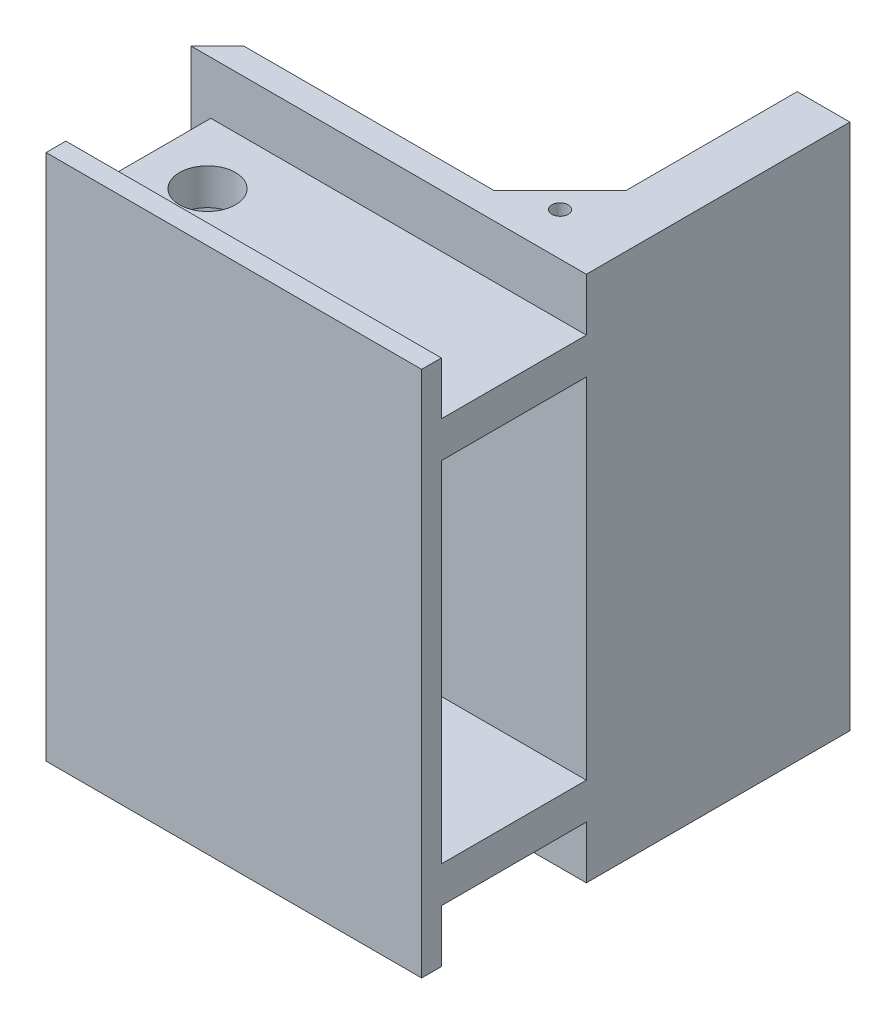
ISO-10303-21;
HEADER;
FILE_DESCRIPTION(('STEP AP214'),'2;1');
FILE_NAME('part.step','',(''),(''),'','','');
FILE_SCHEMA(('AUTOMOTIVE_DESIGN { 1 0 10303 214 1 1 1 1 }'));
ENDSEC;
DATA;
#1=APPLICATION_CONTEXT('core data for automotive mechanical design processes');
#2=APPLICATION_PROTOCOL_DEFINITION('international standard','automotive_design',2000,#1);
#3=PRODUCT_CONTEXT('',#1,'mechanical');
#4=PRODUCT('Part','Part','',(#3));
#5=PRODUCT_RELATED_PRODUCT_CATEGORY('part','',(#4));
#6=PRODUCT_DEFINITION_FORMATION('','',#4);
#7=PRODUCT_DEFINITION_CONTEXT('part definition',#1,'design');
#8=PRODUCT_DEFINITION('design','',#6,#7);
#9=PRODUCT_DEFINITION_SHAPE('','',#8);
#10=(LENGTH_UNIT() NAMED_UNIT(*) SI_UNIT(.MILLI.,.METRE.));
#11=(NAMED_UNIT(*) PLANE_ANGLE_UNIT() SI_UNIT($,.RADIAN.));
#12=(NAMED_UNIT(*) SI_UNIT($,.STERADIAN.) SOLID_ANGLE_UNIT());
#13=UNCERTAINTY_MEASURE_WITH_UNIT(LENGTH_MEASURE(1.E-05),#10,'distance_accuracy_value','');
#14=(GEOMETRIC_REPRESENTATION_CONTEXT(3) GLOBAL_UNCERTAINTY_ASSIGNED_CONTEXT((#13)) GLOBAL_UNIT_ASSIGNED_CONTEXT((#10,
#11,#12)) REPRESENTATION_CONTEXT('',''));
#15=CARTESIAN_POINT('',(0.,0.,0.));
#16=DIRECTION('',(0.,0.,1.));
#17=DIRECTION('',(1.,0.,0.));
#18=AXIS2_PLACEMENT_3D('',#15,#16,#17);
#19=CARTESIAN_POINT('',(-15.3516499079451,0.,15.687272498387));
#20=DIRECTION('',(0.707106781186544,0.,0.707106781186551));
#21=DIRECTION('',(0.,-1.,0.));
#22=AXIS2_PLACEMENT_3D('',#19,#20,#21);
#23=PLANE('',#22);
#24=DIRECTION('',(0.707106781186551,0.,-0.707106781186544));
#25=VECTOR('',#24,1.);
#26=CARTESIAN_POINT('',(-15.3516499079451,-4.00000000000001,15.687272498387));
#27=LINE('',#26,#25);
#28=CARTESIAN_POINT('',(-15.3516499079451,-4.00000000000001,15.687272498387));
#29=VERTEX_POINT('',#28);
#30=CARTESIAN_POINT('',(-5.35164990794507,-4.00000000000001,5.68727249838705));
#31=VERTEX_POINT('',#30);
#32=EDGE_CURVE('E11',#29,#31,#27,.T.);
#33=ORIENTED_EDGE('',*,*,#32,.F.);
#34=DIRECTION('',(0.,-1.,0.));
#35=VECTOR('',#34,1.);
#36=CARTESIAN_POINT('',(-15.3516499079451,0.,15.687272498387));
#37=LINE('',#36,#35);
#38=CARTESIAN_POINT('',(-15.3516499079451,0.,15.687272498387));
#39=VERTEX_POINT('',#38);
#40=EDGE_CURVE('E361',#39,#29,#37,.T.);
#41=ORIENTED_EDGE('',*,*,#40,.F.);
#42=DIRECTION('',(-0.707106781186551,0.,0.707106781186544));
#43=VECTOR('',#42,1.);
#44=CARTESIAN_POINT('',(-15.3516499079451,0.,15.687272498387));
#45=LINE('',#44,#43);
#46=CARTESIAN_POINT('',(-5.35164990794507,0.,5.68727249838709));
#47=VERTEX_POINT('',#46);
#48=EDGE_CURVE('E370',#47,#39,#45,.T.);
#49=ORIENTED_EDGE('',*,*,#48,.F.);
#50=DIRECTION('',(0.,1.,0.));
#51=VECTOR('',#50,1.);
#52=CARTESIAN_POINT('',(-5.35164990794507,0.,5.68727249838709));
#53=LINE('',#52,#51);
#54=EDGE_CURVE('E364',#31,#47,#53,.T.);
#55=ORIENTED_EDGE('',*,*,#54,.F.);
#56=EDGE_LOOP('',(#33,#41,#49,#55));
#57=FACE_BOUND('',#56,.T.);
#58=ADVANCED_FACE('F42',(#57),#23,.F.);
#59=DIRECTION('',(-0.707106781186551,0.,0.707106781186544));
#60=VECTOR('',#59,1.);
#61=CARTESIAN_POINT('',(-15.3516499079451,-76.,15.687272498387));
#62=LINE('',#61,#60);
#63=CARTESIAN_POINT('',(-5.35164990794507,-76.,5.68727249838705));
#64=VERTEX_POINT('',#63);
#65=CARTESIAN_POINT('',(-15.3516499079451,-76.,15.687272498387));
#66=VERTEX_POINT('',#65);
#67=EDGE_CURVE('E51',#64,#66,#62,.T.);
#68=ORIENTED_EDGE('',*,*,#67,.F.);
#69=CARTESIAN_POINT('',(-5.35164990794509,-80.,5.68727249838709));
#70=VERTEX_POINT('',#69);
#71=EDGE_CURVE('E365',#70,#64,#53,.T.);
#72=ORIENTED_EDGE('',*,*,#71,.F.);
#73=DIRECTION('',(0.707106781186551,0.,-0.707106781186544));
#74=VECTOR('',#73,1.);
#75=CARTESIAN_POINT('',(0.167811295221029,-80.,0.167811295221031));
#76=LINE('',#75,#74);
#77=CARTESIAN_POINT('',(-15.3516499079451,-80.,15.687272498387));
#78=VERTEX_POINT('',#77);
#79=EDGE_CURVE('E368',#78,#70,#76,.T.);
#80=ORIENTED_EDGE('',*,*,#79,.F.);
#81=EDGE_CURVE('E355',#66,#78,#37,.T.);
#82=ORIENTED_EDGE('',*,*,#81,.F.);
#83=EDGE_LOOP('',(#68,#72,#80,#82));
#84=FACE_BOUND('',#83,.T.);
#85=ADVANCED_FACE('F390',(#84),#23,.F.);
#86=CARTESIAN_POINT('',(-18.832188704779,-80.,-18.832188704779));
#87=DIRECTION('',(-0.707106781186548,0.,-0.707106781186548));
#88=DIRECTION('',(-0.707106781186548,0.,0.707106781186548));
#89=AXIS2_PLACEMENT_3D('',#86,#87,#88);
#90=PLANE('',#89);
#91=DIRECTION('',(-0.707106781186548,0.,0.707106781186548));
#92=VECTOR('',#91,1.);
#93=CARTESIAN_POINT('',(-18.832188704779,0.,-18.832188704779));
#94=LINE('',#93,#92);
#95=CARTESIAN_POINT('',(-53.3516499079451,0.,15.687272498387));
#96=VERTEX_POINT('',#95);
#97=CARTESIAN_POINT('',(-57.3516499079451,0.,19.687272498387));
#98=VERTEX_POINT('',#97);
#99=EDGE_CURVE('E330',#96,#98,#94,.T.);
#100=ORIENTED_EDGE('',*,*,#99,.F.);
#101=DIRECTION('',(0.,1.,0.));
#102=VECTOR('',#101,1.);
#103=CARTESIAN_POINT('',(-53.3516499079451,0.,15.687272498387));
#104=LINE('',#103,#102);
#105=CARTESIAN_POINT('',(-53.3516499079451,-80.,15.687272498387));
#106=VERTEX_POINT('',#105);
#107=EDGE_CURVE('E290',#106,#96,#104,.T.);
#108=ORIENTED_EDGE('',*,*,#107,.F.);
#109=DIRECTION('',(-0.707106781186548,0.,0.707106781186548));
#110=VECTOR('',#109,1.);
#111=CARTESIAN_POINT('',(-18.832188704779,-80.,-18.832188704779));
#112=LINE('',#111,#110);
#113=CARTESIAN_POINT('',(-57.3516499079451,-80.,19.687272498387));
#114=VERTEX_POINT('',#113);
#115=EDGE_CURVE('E333',#106,#114,#112,.T.);
#116=ORIENTED_EDGE('',*,*,#115,.T.);
#117=DIRECTION('',(0.,1.,0.));
#118=VECTOR('',#117,1.);
#119=CARTESIAN_POINT('',(-57.3516499079451,-80.,19.687272498387));
#120=LINE('',#119,#118);
#121=EDGE_CURVE('E343',#114,#98,#120,.T.);
#122=ORIENTED_EDGE('',*,*,#121,.T.);
#123=EDGE_LOOP('',(#100,#108,#116,#122));
#124=FACE_BOUND('',#123,.T.);
#125=ADVANCED_FACE('F410',(#124),#90,.T.);
#126=CARTESIAN_POINT('',(-54.3516499079451,-7.99999999999999,19.687272498387));
#127=DIRECTION('',(0.,1.,0.));
#128=DIRECTION('',(0.,0.,1.));
#129=AXIS2_PLACEMENT_3D('',#126,#127,#128);
#130=PLANE('',#129);
#131=CARTESIAN_POINT('',(-45.3516499079451,-7.99999999999999,29.187272498387));
#132=DIRECTION('',(0.,1.,0.));
#133=DIRECTION('',(0.,0.,1.));
#134=AXIS2_PLACEMENT_3D('',#131,#132,#133);
#135=CIRCLE('',#134,4.25);
#136=CARTESIAN_POINT('',(-45.3516499079451,-7.99999999999999,33.437272498387));
#137=VERTEX_POINT('',#136);
#138=EDGE_CURVE('E245',#137,#137,#135,.T.);
#139=ORIENTED_EDGE('',*,*,#138,.F.);
#140=EDGE_LOOP('',(#139));
#141=FACE_BOUND('',#140,.T.);
#142=DIRECTION('',(0.,0.,1.));
#143=VECTOR('',#142,1.);
#144=CARTESIAN_POINT('',(-54.3516499079451,-7.99999999999999,19.687272498387));
#145=LINE('',#144,#143);
#146=CARTESIAN_POINT('',(-54.3516499079451,-7.99999999999999,19.687272498387));
#147=VERTEX_POINT('',#146);
#148=CARTESIAN_POINT('',(-54.3516499079451,-7.99999999999999,41.6872724983871));
#149=VERTEX_POINT('',#148);
#150=EDGE_CURVE('E320',#147,#149,#145,.T.);
#151=ORIENTED_EDGE('',*,*,#150,.T.);
#152=DIRECTION('',(-1.,0.,0.));
#153=VECTOR('',#152,1.);
#154=CARTESIAN_POINT('',(2.64835009205493,-7.99999999999999,41.6872724983871));
#155=LINE('',#154,#153);
#156=CARTESIAN_POINT('',(2.64835009205493,-7.99999999999999,41.6872724983871));
#157=VERTEX_POINT('',#156);
#158=EDGE_CURVE('E236',#157,#149,#155,.T.);
#159=ORIENTED_EDGE('',*,*,#158,.F.);
#160=DIRECTION('',(0.,0.,1.));
#161=VECTOR('',#160,1.);
#162=CARTESIAN_POINT('',(2.64835009205493,-7.99999999999999,19.687272498387));
#163=LINE('',#162,#161);
#164=CARTESIAN_POINT('',(2.64835009205493,-7.99999999999999,19.687272498387));
#165=VERTEX_POINT('',#164);
#166=EDGE_CURVE('E316',#165,#157,#163,.T.);
#167=ORIENTED_EDGE('',*,*,#166,.F.);
#168=DIRECTION('',(1.,0.,0.));
#169=VECTOR('',#168,1.);
#170=CARTESIAN_POINT('',(-54.3516499079451,-7.99999999999999,19.687272498387));
#171=LINE('',#170,#169);
#172=EDGE_CURVE('E326',#147,#165,#171,.T.);
#173=ORIENTED_EDGE('',*,*,#172,.F.);
#174=EDGE_LOOP('',(#151,#159,#167,#173));
#175=FACE_BOUND('',#174,.T.);
#176=ADVANCED_FACE('F453',(#141,#175),#130,.T.);
#177=CARTESIAN_POINT('',(-54.3516499079451,-72.,19.687272498387));
#178=DIRECTION('',(0.,-1.,0.));
#179=DIRECTION('',(0.,0.,-1.));
#180=AXIS2_PLACEMENT_3D('',#177,#178,#179);
#181=PLANE('',#180);
#182=CARTESIAN_POINT('',(-45.3516499079451,-72.,29.187272498387));
#183=DIRECTION('',(0.,-1.,0.));
#184=DIRECTION('',(0.,0.,-1.));
#185=AXIS2_PLACEMENT_3D('',#182,#183,#184);
#186=CIRCLE('',#185,4.25);
#187=CARTESIAN_POINT('',(-45.3516499079451,-72.,24.937272498387));
#188=VERTEX_POINT('',#187);
#189=EDGE_CURVE('E209',#188,#188,#186,.T.);
#190=ORIENTED_EDGE('',*,*,#189,.F.);
#191=EDGE_LOOP('',(#190));
#192=FACE_BOUND('',#191,.T.);
#193=DIRECTION('',(0.,0.,-1.));
#194=VECTOR('',#193,1.);
#195=CARTESIAN_POINT('',(2.64835009205493,-72.,19.687272498387));
#196=LINE('',#195,#194);
#197=CARTESIAN_POINT('',(2.64835009205493,-72.,41.687272498387));
#198=VERTEX_POINT('',#197);
#199=CARTESIAN_POINT('',(2.64835009205493,-72.,19.687272498387));
#200=VERTEX_POINT('',#199);
#201=EDGE_CURVE('E194',#198,#200,#196,.T.);
#202=ORIENTED_EDGE('',*,*,#201,.F.);
#203=DIRECTION('',(-1.,0.,0.));
#204=VECTOR('',#203,1.);
#205=CARTESIAN_POINT('',(2.64835009205493,-72.,41.687272498387));
#206=LINE('',#205,#204);
#207=CARTESIAN_POINT('',(-54.3516499079451,-72.,41.687272498387));
#208=VERTEX_POINT('',#207);
#209=EDGE_CURVE('E196',#198,#208,#206,.T.);
#210=ORIENTED_EDGE('',*,*,#209,.T.);
#211=DIRECTION('',(0.,0.,-1.));
#212=VECTOR('',#211,1.);
#213=CARTESIAN_POINT('',(-54.3516499079451,-72.,19.687272498387));
#214=LINE('',#213,#212);
#215=CARTESIAN_POINT('',(-54.3516499079451,-72.,19.687272498387));
#216=VERTEX_POINT('',#215);
#217=EDGE_CURVE('E324',#208,#216,#214,.T.);
#218=ORIENTED_EDGE('',*,*,#217,.T.);
#219=DIRECTION('',(1.,0.,0.));
#220=VECTOR('',#219,1.);
#221=CARTESIAN_POINT('',(-54.3516499079451,-72.,19.687272498387));
#222=LINE('',#221,#220);
#223=EDGE_CURVE('E199',#216,#200,#222,.T.);
#224=ORIENTED_EDGE('',*,*,#223,.T.);
#225=EDGE_LOOP('',(#202,#210,#218,#224));
#226=FACE_BOUND('',#225,.T.);
#227=ADVANCED_FACE('F195',(#192,#226),#181,.T.);
#228=CARTESIAN_POINT('',(0.,-80.,-20.312727501613));
#229=DIRECTION('',(0.,0.,1.));
#230=DIRECTION('',(1.,0.,0.));
#231=AXIS2_PLACEMENT_3D('',#228,#229,#230);
#232=PLANE('',#231);
#233=DIRECTION('',(1.,0.,0.));
#234=VECTOR('',#233,1.);
#235=CARTESIAN_POINT('',(0.,-80.,-20.312727501613));
#236=LINE('',#235,#234);
#237=CARTESIAN_POINT('',(-5.35164990794509,-80.,-20.312727501613));
#238=VERTEX_POINT('',#237);
#239=CARTESIAN_POINT('',(2.64835009205492,-80.,-20.312727501613));
#240=VERTEX_POINT('',#239);
#241=EDGE_CURVE('E341',#238,#240,#236,.T.);
#242=ORIENTED_EDGE('',*,*,#241,.F.);
#243=DIRECTION('',(0.,-1.,0.));
#244=VECTOR('',#243,1.);
#245=CARTESIAN_POINT('',(-5.35164990794507,0.,-20.312727501613));
#246=LINE('',#245,#244);
#247=CARTESIAN_POINT('',(-5.35164990794507,0.,-20.312727501613));
#248=VERTEX_POINT('',#247);
#249=EDGE_CURVE('E287',#248,#238,#246,.T.);
#250=ORIENTED_EDGE('',*,*,#249,.F.);
#251=DIRECTION('',(1.,0.,0.));
#252=VECTOR('',#251,1.);
#253=CARTESIAN_POINT('',(0.,0.,-20.312727501613));
#254=LINE('',#253,#252);
#255=CARTESIAN_POINT('',(2.64835009205492,0.,-20.312727501613));
#256=VERTEX_POINT('',#255);
#257=EDGE_CURVE('E336',#248,#256,#254,.T.);
#258=ORIENTED_EDGE('',*,*,#257,.T.);
#259=DIRECTION('',(0.,1.,0.));
#260=VECTOR('',#259,1.);
#261=CARTESIAN_POINT('',(2.64835009205492,-80.,-20.312727501613));
#262=LINE('',#261,#260);
#263=EDGE_CURVE('E352',#240,#256,#262,.T.);
#264=ORIENTED_EDGE('',*,*,#263,.F.);
#265=EDGE_LOOP('',(#242,#250,#258,#264));
#266=FACE_BOUND('',#265,.T.);
#267=ADVANCED_FACE('F428',(#266),#232,.F.);
#268=CARTESIAN_POINT('',(2.64835009205493,-80.,0.));
#269=DIRECTION('',(-1.,0.,0.));
#270=DIRECTION('',(0.,0.,1.));
#271=AXIS2_PLACEMENT_3D('',#268,#269,#270);
#272=PLANE('',#271);
#273=DIRECTION('',(0.,1.,0.));
#274=VECTOR('',#273,1.);
#275=CARTESIAN_POINT('',(2.64835009205493,-66.5,41.687272498387));
#276=LINE('',#275,#274);
#277=CARTESIAN_POINT('',(2.64835009205493,-66.5,41.687272498387));
#278=VERTEX_POINT('',#277);
#279=CARTESIAN_POINT('',(2.64835009205493,-13.5,41.687272498387));
#280=VERTEX_POINT('',#279);
#281=EDGE_CURVE('E221',#278,#280,#276,.T.);
#282=ORIENTED_EDGE('',*,*,#281,.T.);
#283=DIRECTION('',(0.,0.,-1.));
#284=VECTOR('',#283,1.);
#285=CARTESIAN_POINT('',(2.64835009205493,-13.5,19.687272498387));
#286=LINE('',#285,#284);
#287=CARTESIAN_POINT('',(2.64835009205493,-13.5,19.687272498387));
#288=VERTEX_POINT('',#287);
#289=EDGE_CURVE('E255',#280,#288,#286,.T.);
#290=ORIENTED_EDGE('',*,*,#289,.T.);
#291=DIRECTION('',(0.,-1.,0.));
#292=VECTOR('',#291,1.);
#293=CARTESIAN_POINT('',(2.64835009205493,-13.5,19.687272498387));
#294=LINE('',#293,#292);
#295=CARTESIAN_POINT('',(2.64835009205493,-66.5,19.687272498387));
#296=VERTEX_POINT('',#295);
#297=EDGE_CURVE('E249',#288,#296,#294,.T.);
#298=ORIENTED_EDGE('',*,*,#297,.T.);
#299=DIRECTION('',(0.,0.,1.));
#300=VECTOR('',#299,1.);
#301=CARTESIAN_POINT('',(2.64835009205493,-66.5,19.687272498387));
#302=LINE('',#301,#300);
#303=EDGE_CURVE('E252',#296,#278,#302,.T.);
#304=ORIENTED_EDGE('',*,*,#303,.T.);
#305=EDGE_LOOP('',(#282,#290,#298,#304));
#306=FACE_BOUND('',#305,.T.);
#307=DIRECTION('',(0.,1.,0.));
#308=VECTOR('',#307,1.);
#309=CARTESIAN_POINT('',(2.64835009205493,-72.,41.687272498387));
#310=LINE('',#309,#308);
#311=CARTESIAN_POINT('',(2.64835009205493,-80.,41.687272498387));
#312=VERTEX_POINT('',#311);
#313=EDGE_CURVE('E59',#312,#198,#310,.T.);
#314=ORIENTED_EDGE('',*,*,#313,.T.);
#315=ORIENTED_EDGE('',*,*,#201,.T.);
#316=DIRECTION('',(0.,1.,0.));
#317=VECTOR('',#316,1.);
#318=CARTESIAN_POINT('',(2.64835009205493,-80.,19.687272498387));
#319=LINE('',#318,#317);
#320=CARTESIAN_POINT('',(2.64835009205493,-80.,19.687272498387));
#321=VERTEX_POINT('',#320);
#322=EDGE_CURVE('E356',#321,#200,#319,.T.);
#323=ORIENTED_EDGE('',*,*,#322,.F.);
#324=DIRECTION('',(0.,0.,1.));
#325=VECTOR('',#324,1.);
#326=CARTESIAN_POINT('',(2.64835009205493,-80.,0.));
#327=LINE('',#326,#325);
#328=EDGE_CURVE('E339',#240,#321,#327,.T.);
#329=ORIENTED_EDGE('',*,*,#328,.F.);
#330=ORIENTED_EDGE('',*,*,#263,.T.);
#331=DIRECTION('',(0.,0.,1.));
#332=VECTOR('',#331,1.);
#333=CARTESIAN_POINT('',(2.64835009205493,0.,0.));
#334=LINE('',#333,#332);
#335=CARTESIAN_POINT('',(2.64835009205493,0.,19.687272498387));
#336=VERTEX_POINT('',#335);
#337=EDGE_CURVE('E348',#256,#336,#334,.T.);
#338=ORIENTED_EDGE('',*,*,#337,.T.);
#339=EDGE_CURVE('E358',#165,#336,#319,.T.);
#340=ORIENTED_EDGE('',*,*,#339,.F.);
#341=ORIENTED_EDGE('',*,*,#166,.T.);
#342=DIRECTION('',(0.,1.,0.));
#343=VECTOR('',#342,1.);
#344=CARTESIAN_POINT('',(2.64835009205493,-7.99999999999999,41.6872724983871));
#345=LINE('',#344,#343);
#346=CARTESIAN_POINT('',(2.64835009205493,0.,41.6872724983871));
#347=VERTEX_POINT('',#346);
#348=EDGE_CURVE('E233',#157,#347,#345,.T.);
#349=ORIENTED_EDGE('',*,*,#348,.T.);
#350=DIRECTION('',(0.,0.,-1.));
#351=VECTOR('',#350,1.);
#352=CARTESIAN_POINT('',(2.64835009205493,0.,44.687272498387));
#353=LINE('',#352,#351);
#354=CARTESIAN_POINT('',(2.64835009205493,0.,44.687272498387));
#355=VERTEX_POINT('',#354);
#356=EDGE_CURVE('E306',#355,#347,#353,.T.);
#357=ORIENTED_EDGE('',*,*,#356,.F.);
#358=DIRECTION('',(0.,-1.,0.));
#359=VECTOR('',#358,1.);
#360=CARTESIAN_POINT('',(2.64835009205493,-7.99999999999999,44.687272498387));
#361=LINE('',#360,#359);
#362=CARTESIAN_POINT('',(2.64835009205493,-80.,44.687272498387));
#363=VERTEX_POINT('',#362);
#364=EDGE_CURVE('E204',#355,#363,#361,.T.);
#365=ORIENTED_EDGE('',*,*,#364,.T.);
#366=DIRECTION('',(0.,0.,1.));
#367=VECTOR('',#366,1.);
#368=CARTESIAN_POINT('',(2.64835009205493,-80.,44.687272498387));
#369=LINE('',#368,#367);
#370=EDGE_CURVE('E215',#312,#363,#369,.T.);
#371=ORIENTED_EDGE('',*,*,#370,.F.);
#372=EDGE_LOOP('',(#314,#315,#323,#329,#330,#338,#340,#341,#349,#357,#365,#371));
#373=FACE_BOUND('',#372,.T.);
#374=ADVANCED_FACE('F213',(#306,#373),#272,.F.);
#375=CARTESIAN_POINT('',(0.,-80.,19.687272498387));
#376=DIRECTION('',(0.,0.,1.));
#377=DIRECTION('',(1.,0.,0.));
#378=AXIS2_PLACEMENT_3D('',#375,#376,#377);
#379=PLANE('',#378);
#380=ORIENTED_EDGE('',*,*,#223,.F.);
#381=DIRECTION('',(0.,1.,0.));
#382=VECTOR('',#381,1.);
#383=CARTESIAN_POINT('',(-54.3516499079451,-7.99999999999999,19.687272498387));
#384=LINE('',#383,#382);
#385=CARTESIAN_POINT('',(-54.3516499079451,-66.5,19.687272498387));
#386=VERTEX_POINT('',#385);
#387=EDGE_CURVE('E317',#216,#386,#384,.T.);
#388=ORIENTED_EDGE('',*,*,#387,.T.);
#389=DIRECTION('',(-1.,0.,0.));
#390=VECTOR('',#389,1.);
#391=CARTESIAN_POINT('',(2.64835009205493,-66.5,19.687272498387));
#392=LINE('',#391,#390);
#393=EDGE_CURVE('E258',#296,#386,#392,.T.);
#394=ORIENTED_EDGE('',*,*,#393,.F.);
#395=ORIENTED_EDGE('',*,*,#297,.F.);
#396=DIRECTION('',(-1.,0.,0.));
#397=VECTOR('',#396,1.);
#398=CARTESIAN_POINT('',(2.64835009205493,-13.5,19.687272498387));
#399=LINE('',#398,#397);
#400=CARTESIAN_POINT('',(-54.3516499079451,-13.5,19.687272498387));
#401=VERTEX_POINT('',#400);
#402=EDGE_CURVE('E262',#288,#401,#399,.T.);
#403=ORIENTED_EDGE('',*,*,#402,.T.);
#404=EDGE_CURVE('E203',#401,#147,#384,.T.);
#405=ORIENTED_EDGE('',*,*,#404,.T.);
#406=ORIENTED_EDGE('',*,*,#172,.T.);
#407=ORIENTED_EDGE('',*,*,#339,.T.);
#408=DIRECTION('',(1.,0.,0.));
#409=VECTOR('',#408,1.);
#410=CARTESIAN_POINT('',(0.,0.,19.687272498387));
#411=LINE('',#410,#409);
#412=EDGE_CURVE('E345',#98,#336,#411,.T.);
#413=ORIENTED_EDGE('',*,*,#412,.F.);
#414=ORIENTED_EDGE('',*,*,#121,.F.);
#415=DIRECTION('',(1.,0.,0.));
#416=VECTOR('',#415,1.);
#417=CARTESIAN_POINT('',(0.,-80.,19.687272498387));
#418=LINE('',#417,#416);
#419=EDGE_CURVE('E335',#114,#321,#418,.T.);
#420=ORIENTED_EDGE('',*,*,#419,.T.);
#421=ORIENTED_EDGE('',*,*,#322,.T.);
#422=EDGE_LOOP('',(#380,#388,#394,#395,#403,#405,#406,#407,#413,#414,#420,#421));
#423=FACE_BOUND('',#422,.T.);
#424=ADVANCED_FACE('F413',(#423),#379,.T.);
#425=CARTESIAN_POINT('',(0.,-80.,0.));
#426=DIRECTION('',(0.,1.,0.));
#427=DIRECTION('',(0.,0.,1.));
#428=AXIS2_PLACEMENT_3D('',#425,#426,#427);
#429=PLANE('',#428);
#430=CARTESIAN_POINT('',(-7.85164990794509,-80.,13.1872724983871));
#431=DIRECTION('',(0.,1.,0.));
#432=DIRECTION('',(0.,0.,1.));
#433=AXIS2_PLACEMENT_3D('',#430,#431,#432);
#434=CIRCLE('',#433,1.25);
#435=CARTESIAN_POINT('',(-7.85164990794509,-80.,14.4372724983871));
#436=VERTEX_POINT('',#435);
#437=EDGE_CURVE('E266',#436,#436,#434,.T.);
#438=ORIENTED_EDGE('',*,*,#437,.T.);
#439=EDGE_LOOP('',(#438));
#440=FACE_BOUND('',#439,.T.);
#441=DIRECTION('',(-1.,0.,0.));
#442=VECTOR('',#441,1.);
#443=CARTESIAN_POINT('',(-5.35164990794509,-80.,15.687272498387));
#444=LINE('',#443,#442);
#445=EDGE_CURVE('E288',#78,#106,#444,.T.);
#446=ORIENTED_EDGE('',*,*,#445,.F.);
#447=ORIENTED_EDGE('',*,*,#79,.T.);
#448=DIRECTION('',(0.,0.,-1.));
#449=VECTOR('',#448,1.);
#450=CARTESIAN_POINT('',(-5.35164990794509,-80.,15.687272498387));
#451=LINE('',#450,#449);
#452=EDGE_CURVE('E295',#70,#238,#451,.T.);
#453=ORIENTED_EDGE('',*,*,#452,.T.);
#454=ORIENTED_EDGE('',*,*,#241,.T.);
#455=ORIENTED_EDGE('',*,*,#328,.T.);
#456=ORIENTED_EDGE('',*,*,#419,.F.);
#457=ORIENTED_EDGE('',*,*,#115,.F.);
#458=EDGE_LOOP('',(#446,#447,#453,#454,#455,#456,#457));
#459=FACE_BOUND('',#458,.T.);
#460=ADVANCED_FACE('F403',(#440,#459),#429,.F.);
#461=CARTESIAN_POINT('',(0.,0.,0.));
#462=DIRECTION('',(0.,1.,0.));
#463=DIRECTION('',(0.,0.,1.));
#464=AXIS2_PLACEMENT_3D('',#461,#462,#463);
#465=PLANE('',#464);
#466=CARTESIAN_POINT('',(-7.85164990794509,0.,13.1872724983871));
#467=DIRECTION('',(0.,1.,0.));
#468=DIRECTION('',(0.,0.,1.));
#469=AXIS2_PLACEMENT_3D('',#466,#467,#468);
#470=CIRCLE('',#469,1.25);
#471=CARTESIAN_POINT('',(-7.85164990794509,0.,14.4372724983871));
#472=VERTEX_POINT('',#471);
#473=EDGE_CURVE('E264',#472,#472,#470,.T.);
#474=ORIENTED_EDGE('',*,*,#473,.F.);
#475=EDGE_LOOP('',(#474));
#476=FACE_BOUND('',#475,.T.);
#477=DIRECTION('',(0.,0.,-1.));
#478=VECTOR('',#477,1.);
#479=CARTESIAN_POINT('',(-5.35164990794507,0.,15.687272498387));
#480=LINE('',#479,#478);
#481=EDGE_CURVE('E298',#47,#248,#480,.T.);
#482=ORIENTED_EDGE('',*,*,#481,.F.);
#483=ORIENTED_EDGE('',*,*,#48,.T.);
#484=DIRECTION('',(1.,0.,0.));
#485=VECTOR('',#484,1.);
#486=CARTESIAN_POINT('',(-5.35164990794507,0.,15.687272498387));
#487=LINE('',#486,#485);
#488=EDGE_CURVE('E292',#96,#39,#487,.T.);
#489=ORIENTED_EDGE('',*,*,#488,.F.);
#490=ORIENTED_EDGE('',*,*,#99,.T.);
#491=ORIENTED_EDGE('',*,*,#412,.T.);
#492=ORIENTED_EDGE('',*,*,#337,.F.);
#493=ORIENTED_EDGE('',*,*,#257,.F.);
#494=EDGE_LOOP('',(#482,#483,#489,#490,#491,#492,#493));
#495=FACE_BOUND('',#494,.T.);
#496=ADVANCED_FACE('F418',(#476,#495),#465,.T.);
#497=CARTESIAN_POINT('',(-54.3516499079451,-7.99999999999999,44.687272498387));
#498=DIRECTION('',(0.,0.,1.));
#499=DIRECTION('',(0.,-1.,0.));
#500=AXIS2_PLACEMENT_3D('',#497,#498,#499);
#501=PLANE('',#500);
#502=ORIENTED_EDGE('',*,*,#364,.F.);
#503=DIRECTION('',(1.,0.,0.));
#504=VECTOR('',#503,1.);
#505=CARTESIAN_POINT('',(-54.3516499079451,0.,44.687272498387));
#506=LINE('',#505,#504);
#507=CARTESIAN_POINT('',(-54.3516499079451,0.,44.687272498387));
#508=VERTEX_POINT('',#507);
#509=EDGE_CURVE('E303',#508,#355,#506,.T.);
#510=ORIENTED_EDGE('',*,*,#509,.F.);
#511=DIRECTION('',(0.,-1.,0.));
#512=VECTOR('',#511,1.);
#513=CARTESIAN_POINT('',(-54.3516499079451,-7.99999999999999,44.687272498387));
#514=LINE('',#513,#512);
#515=CARTESIAN_POINT('',(-54.3516499079451,-80.,44.687272498387));
#516=VERTEX_POINT('',#515);
#517=EDGE_CURVE('E322',#508,#516,#514,.T.);
#518=ORIENTED_EDGE('',*,*,#517,.T.);
#519=DIRECTION('',(-1.,0.,0.));
#520=VECTOR('',#519,1.);
#521=CARTESIAN_POINT('',(-54.3516499079451,-80.,44.687272498387));
#522=LINE('',#521,#520);
#523=EDGE_CURVE('E313',#363,#516,#522,.T.);
#524=ORIENTED_EDGE('',*,*,#523,.F.);
#525=EDGE_LOOP('',(#502,#510,#518,#524));
#526=FACE_BOUND('',#525,.T.);
#527=ADVANCED_FACE('F462',(#526),#501,.T.);
#528=CARTESIAN_POINT('',(-54.3516499079451,0.,0.));
#529=DIRECTION('',(-1.,0.,0.));
#530=DIRECTION('',(0.,0.,1.));
#531=AXIS2_PLACEMENT_3D('',#528,#529,#530);
#532=PLANE('',#531);
#533=ORIENTED_EDGE('',*,*,#217,.F.);
#534=DIRECTION('',(0.,1.,0.));
#535=VECTOR('',#534,1.);
#536=CARTESIAN_POINT('',(-54.3516499079451,-72.,41.687272498387));
#537=LINE('',#536,#535);
#538=CARTESIAN_POINT('',(-54.3516499079451,-80.,41.687272498387));
#539=VERTEX_POINT('',#538);
#540=EDGE_CURVE('E208',#539,#208,#537,.T.);
#541=ORIENTED_EDGE('',*,*,#540,.F.);
#542=DIRECTION('',(0.,0.,-1.));
#543=VECTOR('',#542,1.);
#544=CARTESIAN_POINT('',(-54.3516499079451,-80.,44.687272498387));
#545=LINE('',#544,#543);
#546=EDGE_CURVE('E309',#516,#539,#545,.T.);
#547=ORIENTED_EDGE('',*,*,#546,.F.);
#548=ORIENTED_EDGE('',*,*,#517,.F.);
#549=DIRECTION('',(0.,0.,1.));
#550=VECTOR('',#549,1.);
#551=CARTESIAN_POINT('',(-54.3516499079451,0.,44.687272498387));
#552=LINE('',#551,#550);
#553=CARTESIAN_POINT('',(-54.3516499079451,0.,41.6872724983871));
#554=VERTEX_POINT('',#553);
#555=EDGE_CURVE('E300',#554,#508,#552,.T.);
#556=ORIENTED_EDGE('',*,*,#555,.F.);
#557=DIRECTION('',(0.,1.,0.));
#558=VECTOR('',#557,1.);
#559=CARTESIAN_POINT('',(-54.3516499079451,-7.99999999999999,41.6872724983871));
#560=LINE('',#559,#558);
#561=EDGE_CURVE('E67',#149,#554,#560,.T.);
#562=ORIENTED_EDGE('',*,*,#561,.F.);
#563=ORIENTED_EDGE('',*,*,#150,.F.);
#564=ORIENTED_EDGE('',*,*,#404,.F.);
#565=DIRECTION('',(0.,0.,-1.));
#566=VECTOR('',#565,1.);
#567=CARTESIAN_POINT('',(-54.3516499079451,-13.5,19.687272498387));
#568=LINE('',#567,#566);
#569=CARTESIAN_POINT('',(-54.3516499079451,-13.5,41.687272498387));
#570=VERTEX_POINT('',#569);
#571=EDGE_CURVE('E253',#570,#401,#568,.T.);
#572=ORIENTED_EDGE('',*,*,#571,.F.);
#573=DIRECTION('',(0.,1.,0.));
#574=VECTOR('',#573,1.);
#575=CARTESIAN_POINT('',(-54.3516499079451,-66.5,41.687272498387));
#576=LINE('',#575,#574);
#577=CARTESIAN_POINT('',(-54.3516499079451,-66.5,41.687272498387));
#578=VERTEX_POINT('',#577);
#579=EDGE_CURVE('E225',#578,#570,#576,.T.);
#580=ORIENTED_EDGE('',*,*,#579,.F.);
#581=DIRECTION('',(0.,0.,1.));
#582=VECTOR('',#581,1.);
#583=CARTESIAN_POINT('',(-54.3516499079451,-66.5,19.687272498387));
#584=LINE('',#583,#582);
#585=EDGE_CURVE('E248',#386,#578,#584,.T.);
#586=ORIENTED_EDGE('',*,*,#585,.F.);
#587=ORIENTED_EDGE('',*,*,#387,.F.);
#588=EDGE_LOOP('',(#533,#541,#547,#548,#556,#562,#563,#564,#572,#580,#586,#587));
#589=FACE_BOUND('',#588,.T.);
#590=ADVANCED_FACE('F435',(#589),#532,.T.);
#591=CARTESIAN_POINT('',(0.,-80.,0.));
#592=DIRECTION('',(0.,-1.,0.));
#593=DIRECTION('',(0.,0.,-1.));
#594=AXIS2_PLACEMENT_3D('',#591,#592,#593);
#595=PLANE('',#594);
#596=DIRECTION('',(-1.,0.,0.));
#597=VECTOR('',#596,1.);
#598=CARTESIAN_POINT('',(2.64835009205493,-80.,41.687272498387));
#599=LINE('',#598,#597);
#600=EDGE_CURVE('E210',#312,#539,#599,.T.);
#601=ORIENTED_EDGE('',*,*,#600,.F.);
#602=ORIENTED_EDGE('',*,*,#370,.T.);
#603=ORIENTED_EDGE('',*,*,#523,.T.);
#604=ORIENTED_EDGE('',*,*,#546,.T.);
#605=EDGE_LOOP('',(#601,#602,#603,#604));
#606=FACE_BOUND('',#605,.T.);
#607=ADVANCED_FACE('F466',(#606),#595,.T.);
#608=CARTESIAN_POINT('',(0.,0.,0.));
#609=DIRECTION('',(0.,-1.,0.));
#610=DIRECTION('',(0.,0.,-1.));
#611=AXIS2_PLACEMENT_3D('',#608,#609,#610);
#612=PLANE('',#611);
#613=ORIENTED_EDGE('',*,*,#356,.T.);
#614=DIRECTION('',(-1.,0.,0.));
#615=VECTOR('',#614,1.);
#616=CARTESIAN_POINT('',(2.64835009205493,0.,41.6872724983871));
#617=LINE('',#616,#615);
#618=EDGE_CURVE('E228',#347,#554,#617,.T.);
#619=ORIENTED_EDGE('',*,*,#618,.T.);
#620=ORIENTED_EDGE('',*,*,#555,.T.);
#621=ORIENTED_EDGE('',*,*,#509,.T.);
#622=EDGE_LOOP('',(#613,#619,#620,#621));
#623=FACE_BOUND('',#622,.T.);
#624=ADVANCED_FACE('F458',(#623),#612,.F.);
#625=CARTESIAN_POINT('',(-5.35164990794507,0.,15.687272498387));
#626=DIRECTION('',(1.,0.,0.));
#627=DIRECTION('',(0.,1.,0.));
#628=AXIS2_PLACEMENT_3D('',#625,#626,#627);
#629=PLANE('',#628);
#630=ORIENTED_EDGE('',*,*,#452,.F.);
#631=ORIENTED_EDGE('',*,*,#71,.T.);
#632=DIRECTION('',(0.,0.,1.));
#633=VECTOR('',#632,1.);
#634=CARTESIAN_POINT('',(-5.35164990794507,-76.,5.68727249838705));
#635=LINE('',#634,#633);
#636=CARTESIAN_POINT('',(-5.35164990794507,-76.,15.687272498387));
#637=VERTEX_POINT('',#636);
#638=EDGE_CURVE('E281',#64,#637,#635,.T.);
#639=ORIENTED_EDGE('',*,*,#638,.T.);
#640=DIRECTION('',(0.,-1.,0.));
#641=VECTOR('',#640,1.);
#642=CARTESIAN_POINT('',(-5.35164990794507,-76.,15.687272498387));
#643=LINE('',#642,#641);
#644=CARTESIAN_POINT('',(-5.35164990794507,-4.00000000000001,15.687272498387));
#645=VERTEX_POINT('',#644);
#646=EDGE_CURVE('E277',#645,#637,#643,.T.);
#647=ORIENTED_EDGE('',*,*,#646,.F.);
#648=DIRECTION('',(0.,0.,1.));
#649=VECTOR('',#648,1.);
#650=CARTESIAN_POINT('',(-5.35164990794507,-4.00000000000001,5.68727249838705));
#651=LINE('',#650,#649);
#652=EDGE_CURVE('E284',#31,#645,#651,.T.);
#653=ORIENTED_EDGE('',*,*,#652,.F.);
#654=ORIENTED_EDGE('',*,*,#54,.T.);
#655=ORIENTED_EDGE('',*,*,#481,.T.);
#656=ORIENTED_EDGE('',*,*,#249,.T.);
#657=EDGE_LOOP('',(#630,#631,#639,#647,#653,#654,#655,#656));
#658=FACE_BOUND('',#657,.T.);
#659=ADVANCED_FACE('F399',(#658),#629,.F.);
#660=CARTESIAN_POINT('',(0.,0.,15.687272498387));
#661=DIRECTION('',(0.,0.,-1.));
#662=DIRECTION('',(-1.,0.,0.));
#663=AXIS2_PLACEMENT_3D('',#660,#661,#662);
#664=PLANE('',#663);
#665=ORIENTED_EDGE('',*,*,#107,.T.);
#666=ORIENTED_EDGE('',*,*,#488,.T.);
#667=ORIENTED_EDGE('',*,*,#40,.T.);
#668=DIRECTION('',(1.,0.,0.));
#669=VECTOR('',#668,1.);
#670=CARTESIAN_POINT('',(-53.3516499079451,-4.,15.687272498387));
#671=LINE('',#670,#669);
#672=EDGE_CURVE('E275',#29,#645,#671,.T.);
#673=ORIENTED_EDGE('',*,*,#672,.T.);
#674=ORIENTED_EDGE('',*,*,#646,.T.);
#675=DIRECTION('',(-1.,0.,0.));
#676=VECTOR('',#675,1.);
#677=CARTESIAN_POINT('',(-53.3516499079451,-76.,15.687272498387));
#678=LINE('',#677,#676);
#679=EDGE_CURVE('E279',#637,#66,#678,.T.);
#680=ORIENTED_EDGE('',*,*,#679,.T.);
#681=ORIENTED_EDGE('',*,*,#81,.T.);
#682=ORIENTED_EDGE('',*,*,#445,.T.);
#683=EDGE_LOOP('',(#665,#666,#667,#673,#674,#680,#681,#682));
#684=FACE_BOUND('',#683,.T.);
#685=ADVANCED_FACE('F393',(#684),#664,.T.);
#686=CARTESIAN_POINT('',(-53.3516499079451,-4.,5.68727249838705));
#687=DIRECTION('',(0.,-1.,0.));
#688=DIRECTION('',(1.,0.,0.));
#689=AXIS2_PLACEMENT_3D('',#686,#687,#688);
#690=PLANE('',#689);
#691=CARTESIAN_POINT('',(-7.85164990794509,-4.,13.1872724983871));
#692=DIRECTION('',(0.,-1.,0.));
#693=DIRECTION('',(1.,0.,0.));
#694=AXIS2_PLACEMENT_3D('',#691,#692,#693);
#695=CIRCLE('',#694,1.25);
#696=CARTESIAN_POINT('',(-6.60164990794509,-4.,13.1872724983871));
#697=VERTEX_POINT('',#696);
#698=EDGE_CURVE('E272',#697,#697,#695,.T.);
#699=ORIENTED_EDGE('',*,*,#698,.F.);
#700=EDGE_LOOP('',(#699));
#701=FACE_BOUND('',#700,.T.);
#702=ORIENTED_EDGE('',*,*,#32,.T.);
#703=ORIENTED_EDGE('',*,*,#652,.T.);
#704=ORIENTED_EDGE('',*,*,#672,.F.);
#705=EDGE_LOOP('',(#702,#703,#704));
#706=FACE_BOUND('',#705,.T.);
#707=ADVANCED_FACE('F382',(#701,#706),#690,.T.);
#708=CARTESIAN_POINT('',(-53.3516499079451,-76.,5.68727249838705));
#709=DIRECTION('',(0.,1.,0.));
#710=DIRECTION('',(0.,0.,1.));
#711=AXIS2_PLACEMENT_3D('',#708,#709,#710);
#712=PLANE('',#711);
#713=CARTESIAN_POINT('',(-7.85164990794509,-76.,13.1872724983871));
#714=DIRECTION('',(0.,1.,0.));
#715=DIRECTION('',(0.,0.,1.));
#716=AXIS2_PLACEMENT_3D('',#713,#714,#715);
#717=CIRCLE('',#716,1.25);
#718=CARTESIAN_POINT('',(-7.85164990794509,-76.,14.4372724983871));
#719=VERTEX_POINT('',#718);
#720=EDGE_CURVE('E269',#719,#719,#717,.T.);
#721=ORIENTED_EDGE('',*,*,#720,.F.);
#722=EDGE_LOOP('',(#721));
#723=FACE_BOUND('',#722,.T.);
#724=ORIENTED_EDGE('',*,*,#67,.T.);
#725=ORIENTED_EDGE('',*,*,#679,.F.);
#726=ORIENTED_EDGE('',*,*,#638,.F.);
#727=EDGE_LOOP('',(#724,#725,#726));
#728=FACE_BOUND('',#727,.T.);
#729=ADVANCED_FACE('F379',(#723,#728),#712,.T.);
#730=CARTESIAN_POINT('',(-7.85164990794509,-80.,13.1872724983871));
#731=DIRECTION('',(0.,1.,0.));
#732=DIRECTION('',(0.,0.,1.));
#733=AXIS2_PLACEMENT_3D('',#730,#731,#732);
#734=CYLINDRICAL_SURFACE('',#733,1.25);
#735=ORIENTED_EDGE('',*,*,#720,.T.);
#736=EDGE_LOOP('',(#735));
#737=FACE_BOUND('',#736,.T.);
#738=ORIENTED_EDGE('',*,*,#437,.F.);
#739=EDGE_LOOP('',(#738));
#740=FACE_BOUND('',#739,.T.);
#741=ADVANCED_FACE('F376',(#737,#740),#734,.F.);
#742=ORIENTED_EDGE('',*,*,#698,.T.);
#743=EDGE_LOOP('',(#742));
#744=FACE_BOUND('',#743,.T.);
#745=ORIENTED_EDGE('',*,*,#473,.T.);
#746=EDGE_LOOP('',(#745));
#747=FACE_BOUND('',#746,.T.);
#748=ADVANCED_FACE('F521',(#744,#747),#734,.F.);
#749=CARTESIAN_POINT('',(2.64835009205493,-13.5,19.687272498387));
#750=DIRECTION('',(0.,1.,0.));
#751=DIRECTION('',(0.,0.,1.));
#752=AXIS2_PLACEMENT_3D('',#749,#750,#751);
#753=PLANE('',#752);
#754=CARTESIAN_POINT('',(-45.3516499079451,-13.5,29.187272498387));
#755=DIRECTION('',(0.,1.,0.));
#756=DIRECTION('',(0.,0.,1.));
#757=AXIS2_PLACEMENT_3D('',#754,#755,#756);
#758=CIRCLE('',#757,4.25);
#759=CARTESIAN_POINT('',(-45.3516499079451,-13.5,33.437272498387));
#760=VERTEX_POINT('',#759);
#761=EDGE_CURVE('E242',#760,#760,#758,.T.);
#762=ORIENTED_EDGE('',*,*,#761,.T.);
#763=EDGE_LOOP('',(#762));
#764=FACE_BOUND('',#763,.T.);
#765=ORIENTED_EDGE('',*,*,#571,.T.);
#766=ORIENTED_EDGE('',*,*,#402,.F.);
#767=ORIENTED_EDGE('',*,*,#289,.F.);
#768=DIRECTION('',(-1.,0.,0.));
#769=VECTOR('',#768,1.);
#770=CARTESIAN_POINT('',(2.64835009205493,-13.5,41.687272498387));
#771=LINE('',#770,#769);
#772=EDGE_CURVE('E218',#280,#570,#771,.T.);
#773=ORIENTED_EDGE('',*,*,#772,.T.);
#774=EDGE_LOOP('',(#765,#766,#767,#773));
#775=FACE_BOUND('',#774,.T.);
#776=ADVANCED_FACE('F448',(#764,#775),#753,.F.);
#777=CARTESIAN_POINT('',(2.64835009205493,-66.5,19.687272498387));
#778=DIRECTION('',(0.,-1.,0.));
#779=DIRECTION('',(0.,0.,-1.));
#780=AXIS2_PLACEMENT_3D('',#777,#778,#779);
#781=PLANE('',#780);
#782=CARTESIAN_POINT('',(-45.3516499079451,-66.5,29.187272498387));
#783=DIRECTION('',(0.,-1.,0.));
#784=DIRECTION('',(0.,0.,-1.));
#785=AXIS2_PLACEMENT_3D('',#782,#783,#784);
#786=CIRCLE('',#785,4.25);
#787=CARTESIAN_POINT('',(-45.3516499079451,-66.5,24.937272498387));
#788=VERTEX_POINT('',#787);
#789=EDGE_CURVE('E46',#788,#788,#786,.T.);
#790=ORIENTED_EDGE('',*,*,#789,.T.);
#791=EDGE_LOOP('',(#790));
#792=FACE_BOUND('',#791,.T.);
#793=ORIENTED_EDGE('',*,*,#585,.T.);
#794=DIRECTION('',(-1.,0.,0.));
#795=VECTOR('',#794,1.);
#796=CARTESIAN_POINT('',(2.64835009205493,-66.5,41.687272498387));
#797=LINE('',#796,#795);
#798=EDGE_CURVE('E224',#278,#578,#797,.T.);
#799=ORIENTED_EDGE('',*,*,#798,.F.);
#800=ORIENTED_EDGE('',*,*,#303,.F.);
#801=ORIENTED_EDGE('',*,*,#393,.T.);
#802=EDGE_LOOP('',(#793,#799,#800,#801));
#803=FACE_BOUND('',#802,.T.);
#804=ADVANCED_FACE('F439',(#792,#803),#781,.F.);
#805=CARTESIAN_POINT('',(-45.3516499079451,0.,29.187272498387));
#806=DIRECTION('',(0.,-1.,0.));
#807=DIRECTION('',(0.,0.,-1.));
#808=AXIS2_PLACEMENT_3D('',#805,#806,#807);
#809=CYLINDRICAL_SURFACE('',#808,4.25);
#810=ORIENTED_EDGE('',*,*,#189,.T.);
#811=EDGE_LOOP('',(#810));
#812=FACE_BOUND('',#811,.T.);
#813=ORIENTED_EDGE('',*,*,#789,.F.);
#814=EDGE_LOOP('',(#813));
#815=FACE_BOUND('',#814,.T.);
#816=ADVANCED_FACE('F508',(#812,#815),#809,.F.);
#817=ORIENTED_EDGE('',*,*,#138,.T.);
#818=EDGE_LOOP('',(#817));
#819=FACE_BOUND('',#818,.T.);
#820=ORIENTED_EDGE('',*,*,#761,.F.);
#821=EDGE_LOOP('',(#820));
#822=FACE_BOUND('',#821,.T.);
#823=ADVANCED_FACE('F511',(#819,#822),#809,.F.);
#824=CARTESIAN_POINT('',(2.64835009205493,-66.5,41.687272498387));
#825=DIRECTION('',(0.,0.,1.));
#826=DIRECTION('',(1.,0.,0.));
#827=AXIS2_PLACEMENT_3D('',#824,#825,#826);
#828=PLANE('',#827);
#829=ORIENTED_EDGE('',*,*,#579,.T.);
#830=ORIENTED_EDGE('',*,*,#772,.F.);
#831=ORIENTED_EDGE('',*,*,#281,.F.);
#832=ORIENTED_EDGE('',*,*,#798,.T.);
#833=EDGE_LOOP('',(#829,#830,#831,#832));
#834=FACE_BOUND('',#833,.T.);
#835=ADVANCED_FACE('F442',(#834),#828,.F.);
#836=CARTESIAN_POINT('',(2.64835009205493,-7.99999999999999,41.6872724983871));
#837=DIRECTION('',(0.,0.,1.));
#838=DIRECTION('',(1.,0.,0.));
#839=AXIS2_PLACEMENT_3D('',#836,#837,#838);
#840=PLANE('',#839);
#841=ORIENTED_EDGE('',*,*,#561,.T.);
#842=ORIENTED_EDGE('',*,*,#618,.F.);
#843=ORIENTED_EDGE('',*,*,#348,.F.);
#844=ORIENTED_EDGE('',*,*,#158,.T.);
#845=EDGE_LOOP('',(#841,#842,#843,#844));
#846=FACE_BOUND('',#845,.T.);
#847=ADVANCED_FACE('F455',(#846),#840,.F.);
#848=CARTESIAN_POINT('',(2.64835009205493,-72.,41.687272498387));
#849=DIRECTION('',(0.,0.,1.));
#850=DIRECTION('',(1.,0.,0.));
#851=AXIS2_PLACEMENT_3D('',#848,#849,#850);
#852=PLANE('',#851);
#853=ORIENTED_EDGE('',*,*,#540,.T.);
#854=ORIENTED_EDGE('',*,*,#209,.F.);
#855=ORIENTED_EDGE('',*,*,#313,.F.);
#856=ORIENTED_EDGE('',*,*,#600,.T.);
#857=EDGE_LOOP('',(#853,#854,#855,#856));
#858=FACE_BOUND('',#857,.T.);
#859=ADVANCED_FACE('F206',(#858),#852,.F.);
#860=CLOSED_SHELL('',(#58,#85,#125,#176,#227,#267,#374,#424,#460,#496,#527,#590,#607,#624,#659,
#685,#707,#729,#741,#748,#776,#804,#816,#823,#835,#847,#859));
#861=MANIFOLD_SOLID_BREP('B2',#860);
#862=ADVANCED_BREP_SHAPE_REPRESENTATION('',(#18,#861),#14);
#863=SHAPE_DEFINITION_REPRESENTATION(#9,#862);
ENDSEC;
END-ISO-10303-21;
